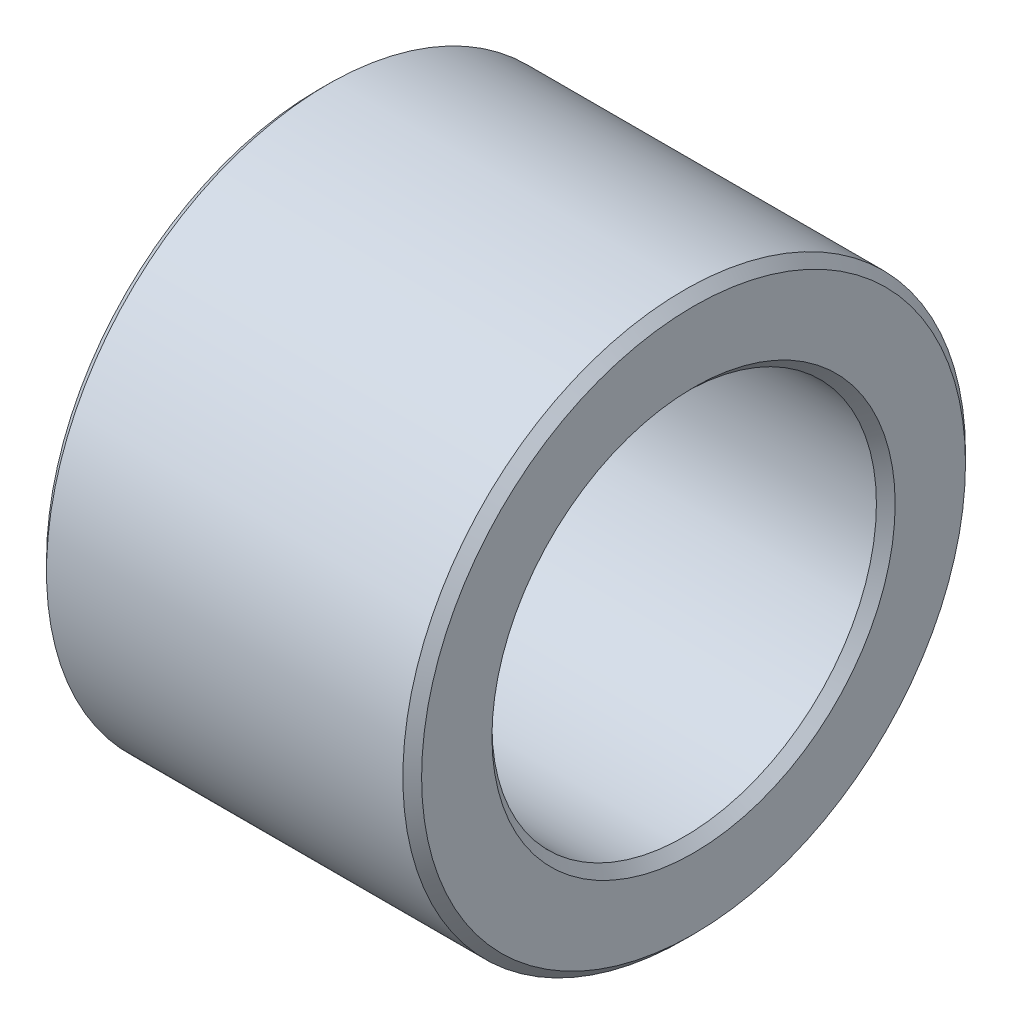
ISO-10303-21;
HEADER;
FILE_DESCRIPTION(('STEP AP214'),'2;1');
FILE_NAME('part.step','',(''),(''),'','','');
FILE_SCHEMA(('AUTOMOTIVE_DESIGN { 1 0 10303 214 1 1 1 1 }'));
ENDSEC;
DATA;
#1=APPLICATION_CONTEXT('core data for automotive mechanical design processes');
#2=APPLICATION_PROTOCOL_DEFINITION('international standard','automotive_design',2000,#1);
#3=PRODUCT_CONTEXT('',#1,'mechanical');
#4=PRODUCT('Part','Part','',(#3));
#5=PRODUCT_RELATED_PRODUCT_CATEGORY('part','',(#4));
#6=PRODUCT_DEFINITION_FORMATION('','',#4);
#7=PRODUCT_DEFINITION_CONTEXT('part definition',#1,'design');
#8=PRODUCT_DEFINITION('design','',#6,#7);
#9=PRODUCT_DEFINITION_SHAPE('','',#8);
#10=(LENGTH_UNIT() NAMED_UNIT(*) SI_UNIT(.MILLI.,.METRE.));
#11=(NAMED_UNIT(*) PLANE_ANGLE_UNIT() SI_UNIT($,.RADIAN.));
#12=(NAMED_UNIT(*) SI_UNIT($,.STERADIAN.) SOLID_ANGLE_UNIT());
#13=UNCERTAINTY_MEASURE_WITH_UNIT(LENGTH_MEASURE(1.E-05),#10,'distance_accuracy_value','');
#14=(GEOMETRIC_REPRESENTATION_CONTEXT(3) GLOBAL_UNCERTAINTY_ASSIGNED_CONTEXT((#13)) GLOBAL_UNIT_ASSIGNED_CONTEXT((#10,
#11,#12)) REPRESENTATION_CONTEXT('',''));
#15=CARTESIAN_POINT('',(0.,0.,0.));
#16=DIRECTION('',(0.,0.,1.));
#17=DIRECTION('',(1.,0.,0.));
#18=AXIS2_PLACEMENT_3D('',#15,#16,#17);
#19=CARTESIAN_POINT('',(4.,0.,0.));
#20=DIRECTION('',(1.,0.,0.));
#21=DIRECTION('',(0.,0.,-1.));
#22=AXIS2_PLACEMENT_3D('',#19,#20,#21);
#23=PLANE('',#22);
#24=CARTESIAN_POINT('',(4.,0.,0.));
#25=DIRECTION('',(1.,0.,0.));
#26=DIRECTION('',(0.,0.,-1.));
#27=AXIS2_PLACEMENT_3D('',#24,#25,#26);
#28=CIRCLE('',#27,2.15);
#29=CARTESIAN_POINT('',(4.,0.,-2.15));
#30=VERTEX_POINT('',#29);
#31=EDGE_CURVE('E62',#30,#30,#28,.F.);
#32=ORIENTED_EDGE('',*,*,#31,.T.);
#33=EDGE_LOOP('',(#32));
#34=FACE_BOUND('',#33,.T.);
#35=CARTESIAN_POINT('',(4.,0.,0.));
#36=DIRECTION('',(1.,0.,0.));
#37=DIRECTION('',(0.,0.,-1.));
#38=AXIS2_PLACEMENT_3D('',#35,#36,#37);
#39=CIRCLE('',#38,2.9);
#40=CARTESIAN_POINT('',(4.,0.,-2.9));
#41=VERTEX_POINT('',#40);
#42=EDGE_CURVE('E65',#41,#41,#39,.T.);
#43=ORIENTED_EDGE('',*,*,#42,.T.);
#44=EDGE_LOOP('',(#43));
#45=FACE_BOUND('',#44,.T.);
#46=ADVANCED_FACE('F41',(#34,#45),#23,.T.);
#47=CARTESIAN_POINT('',(0.,0.,0.));
#48=DIRECTION('',(1.,0.,0.));
#49=DIRECTION('',(0.,0.,-1.));
#50=AXIS2_PLACEMENT_3D('',#47,#48,#49);
#51=PLANE('',#50);
#52=CARTESIAN_POINT('',(0.,0.,0.));
#53=DIRECTION('',(1.,0.,0.));
#54=DIRECTION('',(0.,0.,-1.));
#55=AXIS2_PLACEMENT_3D('',#52,#53,#54);
#56=CIRCLE('',#55,2.15);
#57=CARTESIAN_POINT('',(0.,0.,2.15));
#58=VERTEX_POINT('',#57);
#59=EDGE_CURVE('E53',#58,#58,#56,.T.);
#60=ORIENTED_EDGE('',*,*,#59,.T.);
#61=EDGE_LOOP('',(#60));
#62=FACE_BOUND('',#61,.T.);
#63=CARTESIAN_POINT('',(0.,0.,0.));
#64=DIRECTION('',(1.,0.,0.));
#65=DIRECTION('',(0.,0.,-1.));
#66=AXIS2_PLACEMENT_3D('',#63,#64,#65);
#67=CIRCLE('',#66,2.9);
#68=CARTESIAN_POINT('',(0.,0.,-2.9));
#69=VERTEX_POINT('',#68);
#70=EDGE_CURVE('E57',#69,#69,#67,.F.);
#71=ORIENTED_EDGE('',*,*,#70,.T.);
#72=EDGE_LOOP('',(#71));
#73=FACE_BOUND('',#72,.T.);
#74=ADVANCED_FACE('F85',(#62,#73),#51,.F.);
#75=CARTESIAN_POINT('',(4.,0.,0.));
#76=DIRECTION('',(-1.,0.,0.));
#77=DIRECTION('',(0.,0.,1.));
#78=AXIS2_PLACEMENT_3D('',#75,#76,#77);
#79=CYLINDRICAL_SURFACE('',#78,3.);
#80=CARTESIAN_POINT('',(0.0999999999999994,0.,0.));
#81=DIRECTION('',(1.,0.,0.));
#82=DIRECTION('',(0.,0.,-1.));
#83=AXIS2_PLACEMENT_3D('',#80,#81,#82);
#84=CIRCLE('',#83,3.);
#85=CARTESIAN_POINT('',(0.0999999999999994,0.,-3.));
#86=VERTEX_POINT('',#85);
#87=EDGE_CURVE('E10',#86,#86,#84,.T.);
#88=ORIENTED_EDGE('',*,*,#87,.T.);
#89=EDGE_LOOP('',(#88));
#90=FACE_BOUND('',#89,.T.);
#91=CARTESIAN_POINT('',(3.9,0.,0.));
#92=DIRECTION('',(1.,0.,0.));
#93=DIRECTION('',(0.,0.,-1.));
#94=AXIS2_PLACEMENT_3D('',#91,#92,#93);
#95=CIRCLE('',#94,3.);
#96=CARTESIAN_POINT('',(3.9,0.,-3.));
#97=VERTEX_POINT('',#96);
#98=EDGE_CURVE('E49',#97,#97,#95,.F.);
#99=ORIENTED_EDGE('',*,*,#98,.T.);
#100=EDGE_LOOP('',(#99));
#101=FACE_BOUND('',#100,.T.);
#102=ADVANCED_FACE('F88',(#90,#101),#79,.T.);
#103=CARTESIAN_POINT('',(4.,0.,0.));
#104=DIRECTION('',(-1.,0.,0.));
#105=DIRECTION('',(0.,0.,1.));
#106=AXIS2_PLACEMENT_3D('',#103,#104,#105);
#107=CYLINDRICAL_SURFACE('',#106,2.05);
#108=CARTESIAN_POINT('',(3.9,0.,0.));
#109=DIRECTION('',(1.,0.,0.));
#110=DIRECTION('',(0.,0.,-1.));
#111=AXIS2_PLACEMENT_3D('',#108,#109,#110);
#112=CIRCLE('',#111,2.05);
#113=CARTESIAN_POINT('',(3.9,0.,-2.05));
#114=VERTEX_POINT('',#113);
#115=EDGE_CURVE('E68',#114,#114,#112,.T.);
#116=ORIENTED_EDGE('',*,*,#115,.T.);
#117=EDGE_LOOP('',(#116));
#118=FACE_BOUND('',#117,.T.);
#119=CARTESIAN_POINT('',(0.0999999999999998,0.,0.));
#120=DIRECTION('',(1.,0.,0.));
#121=DIRECTION('',(0.,0.,-1.));
#122=AXIS2_PLACEMENT_3D('',#119,#120,#121);
#123=CIRCLE('',#122,2.05);
#124=CARTESIAN_POINT('',(0.0999999999999998,0.,2.05));
#125=VERTEX_POINT('',#124);
#126=EDGE_CURVE('E71',#125,#125,#123,.F.);
#127=ORIENTED_EDGE('',*,*,#126,.T.);
#128=EDGE_LOOP('',(#127));
#129=FACE_BOUND('',#128,.T.);
#130=ADVANCED_FACE('F75',(#118,#129),#107,.F.);
#131=CARTESIAN_POINT('',(3.9,0.,0.));
#132=DIRECTION('',(1.,0.,0.));
#133=DIRECTION('',(0.,0.,-1.));
#134=AXIS2_PLACEMENT_3D('',#131,#132,#133);
#135=CONICAL_SURFACE('',#134,2.05,0.78539816339744);
#136=ORIENTED_EDGE('',*,*,#31,.F.);
#137=EDGE_LOOP('',(#136));
#138=FACE_BOUND('',#137,.T.);
#139=ORIENTED_EDGE('',*,*,#115,.F.);
#140=EDGE_LOOP('',(#139));
#141=FACE_BOUND('',#140,.T.);
#142=ADVANCED_FACE('F81',(#138,#141),#135,.F.);
#143=CARTESIAN_POINT('',(0.,0.,0.));
#144=DIRECTION('',(-1.,0.,0.));
#145=DIRECTION('',(0.,0.,1.));
#146=AXIS2_PLACEMENT_3D('',#143,#144,#145);
#147=CONICAL_SURFACE('',#146,2.15,0.785398163397442);
#148=CARTESIAN_POINT('',(0.0999999999999998,0.,2.05));
#149=CARTESIAN_POINT('',(0.0989583333333332,0.,2.05104166666667));
#150=CARTESIAN_POINT('',(0.0979166666666666,0.,2.05208333333333));
#151=CARTESIAN_POINT('',(0.0958333333333332,0.,2.05416666666667));
#152=CARTESIAN_POINT('',(0.0947916666666665,0.,2.05520833333333));
#153=CARTESIAN_POINT('',(0.0927083333333331,0.,2.05729166666667));
#154=CARTESIAN_POINT('',(0.0916666666666665,0.,2.05833333333333));
#155=CARTESIAN_POINT('',(0.0895833333333332,0.,2.06041666666667));
#156=CARTESIAN_POINT('',(0.0885416666666665,0.,2.06145833333333));
#157=CARTESIAN_POINT('',(0.0864583333333332,0.,2.06354166666667));
#158=CARTESIAN_POINT('',(0.0854166666666665,0.,2.06458333333333));
#159=CARTESIAN_POINT('',(0.0833333333333331,0.,2.06666666666667));
#160=CARTESIAN_POINT('',(0.0822916666666665,0.,2.06770833333333));
#161=CARTESIAN_POINT('',(0.0802083333333332,0.,2.06979166666667));
#162=CARTESIAN_POINT('',(0.0791666666666665,0.,2.07083333333333));
#163=CARTESIAN_POINT('',(0.0770833333333332,0.,2.07291666666667));
#164=CARTESIAN_POINT('',(0.0760416666666666,0.,2.07395833333333));
#165=CARTESIAN_POINT('',(0.0739583333333332,0.,2.07604166666667));
#166=CARTESIAN_POINT('',(0.0729166666666665,0.,2.07708333333333));
#167=CARTESIAN_POINT('',(0.0708333333333332,0.,2.07916666666667));
#168=CARTESIAN_POINT('',(0.0697916666666665,0.,2.08020833333333));
#169=CARTESIAN_POINT('',(0.0677083333333332,0.,2.08229166666667));
#170=CARTESIAN_POINT('',(0.0666666666666666,0.,2.08333333333333));
#171=CARTESIAN_POINT('',(0.0645833333333332,0.,2.08541666666667));
#172=CARTESIAN_POINT('',(0.0635416666666665,0.,2.08645833333333));
#173=CARTESIAN_POINT('',(0.0614583333333332,0.,2.08854166666667));
#174=CARTESIAN_POINT('',(0.0604166666666665,0.,2.08958333333333));
#175=CARTESIAN_POINT('',(0.0583333333333333,0.,2.09166666666667));
#176=CARTESIAN_POINT('',(0.0572916666666666,0.,2.09270833333333));
#177=CARTESIAN_POINT('',(0.0552083333333333,0.,2.09479166666667));
#178=CARTESIAN_POINT('',(0.0541666666666665,0.,2.09583333333333));
#179=CARTESIAN_POINT('',(0.0520833333333332,0.,2.09791666666667));
#180=CARTESIAN_POINT('',(0.0510416666666665,0.,2.09895833333333));
#181=CARTESIAN_POINT('',(0.0489583333333333,0.,2.10104166666667));
#182=CARTESIAN_POINT('',(0.0479166666666666,0.,2.10208333333333));
#183=CARTESIAN_POINT('',(0.0458333333333333,0.,2.10416666666667));
#184=CARTESIAN_POINT('',(0.0447916666666666,0.,2.10520833333333));
#185=CARTESIAN_POINT('',(0.0427083333333332,0.,2.10729166666667));
#186=CARTESIAN_POINT('',(0.0416666666666666,0.,2.10833333333333));
#187=CARTESIAN_POINT('',(0.0395833333333333,0.,2.11041666666667));
#188=CARTESIAN_POINT('',(0.0385416666666666,0.,2.11145833333333));
#189=CARTESIAN_POINT('',(0.0364583333333333,0.,2.11354166666667));
#190=CARTESIAN_POINT('',(0.0354166666666666,0.,2.11458333333333));
#191=CARTESIAN_POINT('',(0.0333333333333332,0.,2.11666666666666));
#192=CARTESIAN_POINT('',(0.0322916666666666,0.,2.11770833333333));
#193=CARTESIAN_POINT('',(0.0302083333333333,0.,2.11979166666667));
#194=CARTESIAN_POINT('',(0.0291666666666667,0.,2.12083333333333));
#195=CARTESIAN_POINT('',(0.0270833333333333,0.,2.12291666666667));
#196=CARTESIAN_POINT('',(0.0260416666666666,0.,2.12395833333333));
#197=CARTESIAN_POINT('',(0.0239583333333332,0.,2.12604166666666));
#198=CARTESIAN_POINT('',(0.0229166666666666,0.,2.12708333333333));
#199=CARTESIAN_POINT('',(0.0208333333333333,0.,2.12916666666667));
#200=CARTESIAN_POINT('',(0.0197916666666666,0.,2.13020833333333));
#201=CARTESIAN_POINT('',(0.0177083333333333,0.,2.13229166666667));
#202=CARTESIAN_POINT('',(0.0166666666666667,0.,2.13333333333333));
#203=CARTESIAN_POINT('',(0.0145833333333333,0.,2.13541666666667));
#204=CARTESIAN_POINT('',(0.0135416666666666,0.,2.13645833333333));
#205=CARTESIAN_POINT('',(0.0114583333333333,0.,2.13854166666667));
#206=CARTESIAN_POINT('',(0.0104166666666666,0.,2.13958333333333));
#207=CARTESIAN_POINT('',(0.00833333333333334,0.,2.14166666666666));
#208=CARTESIAN_POINT('',(0.0072916666666667,0.,2.14270833333333));
#209=CARTESIAN_POINT('',(0.00520833333333335,0.,2.14479166666667));
#210=CARTESIAN_POINT('',(0.00416666666666666,0.,2.14583333333333));
#211=CARTESIAN_POINT('',(0.00208333333333326,0.,2.14791666666666));
#212=CARTESIAN_POINT('',(0.00104166666666656,0.,2.14895833333333));
#213=CARTESIAN_POINT('',(0.,0.,2.15));
#214=B_SPLINE_CURVE_WITH_KNOTS('',3,(#148,#149,#150,#151,#152,#153,#154,#155,#156,#157,#158,
#159,#160,#161,#162,#163,#164,#165,#166,#167,#168,#169,#170,#171,#172,#173,#174,#175,#176,#177,
#178,#179,#180,#181,#182,#183,#184,#185,#186,#187,#188,#189,#190,#191,#192,#193,#194,#195,#196,
#197,#198,#199,#200,#201,#202,#203,#204,#205,#206,#207,#208,#209,#210,#211,#212,#213),
.UNSPECIFIED.,.F.,.F.,(4,2,2,2,2,2,2,2,2,2,2,2,2,2,2,2,2,2,2,2,2,2,2,2,2,2,2,2,2,2,2,2,4),(0.,
0.00441941738241598,0.00883883476483166,0.0132582521472476,0.0176776695296636,
0.0220970869120793,0.0265165042944953,0.0309359216769113,0.0353553390593272,0.0397747564417429,
0.0441941738241589,0.0486135912065749,0.0530330085889906,0.0574524259714065,0.0618718433538225,
0.0662912607362382,0.0707106781186542,0.0751300955010702,0.0795495128834858,0.0839689302659018,
0.0883883476483178,0.0928077650307335,0.0972271824131494,0.101646599795565,0.106066017177981,
0.110485434560397,0.114904851942813,0.119324269325229,0.123743686707645,0.128163104090061,
0.132582521472477,0.137001938854892,0.141421356237308),.UNSPECIFIED.);
#215=EDGE_CURVE('BSEAM77',#125,#58,#214,.T.);
#216=ORIENTED_EDGE('',*,*,#126,.F.);
#217=ORIENTED_EDGE('',*,*,#59,.F.);
#218=ORIENTED_EDGE('',*,*,#215,.T.);
#219=ORIENTED_EDGE('',*,*,#215,.F.);
#220=EDGE_LOOP('',(#216,#218,#217,#219));
#221=FACE_BOUND('',#220,.T.);
#222=ADVANCED_FACE('F77',(#221),#147,.F.);
#223=CARTESIAN_POINT('',(0.0999999999999994,0.,0.));
#224=DIRECTION('',(1.,0.,0.));
#225=DIRECTION('',(0.,0.,-1.));
#226=AXIS2_PLACEMENT_3D('',#223,#224,#225);
#227=CONICAL_SURFACE('',#226,3.,0.78539816339745);
#228=ORIENTED_EDGE('',*,*,#70,.F.);
#229=EDGE_LOOP('',(#228));
#230=FACE_BOUND('',#229,.T.);
#231=ORIENTED_EDGE('',*,*,#87,.F.);
#232=EDGE_LOOP('',(#231));
#233=FACE_BOUND('',#232,.T.);
#234=ADVANCED_FACE('F80',(#230,#233),#227,.T.);
#235=CARTESIAN_POINT('',(4.,0.,0.));
#236=DIRECTION('',(-1.,0.,0.));
#237=DIRECTION('',(0.,0.,1.));
#238=AXIS2_PLACEMENT_3D('',#235,#236,#237);
#239=CONICAL_SURFACE('',#238,2.9,0.785398163397446);
#240=ORIENTED_EDGE('',*,*,#98,.F.);
#241=EDGE_LOOP('',(#240));
#242=FACE_BOUND('',#241,.T.);
#243=ORIENTED_EDGE('',*,*,#42,.F.);
#244=EDGE_LOOP('',(#243));
#245=FACE_BOUND('',#244,.T.);
#246=ADVANCED_FACE('F44',(#242,#245),#239,.T.);
#247=CLOSED_SHELL('',(#46,#74,#102,#130,#142,#222,#234,#246));
#248=MANIFOLD_SOLID_BREP('B2',#247);
#249=ADVANCED_BREP_SHAPE_REPRESENTATION('',(#18,#248),#14);
#250=SHAPE_DEFINITION_REPRESENTATION(#9,#249);
ENDSEC;
END-ISO-10303-21;
